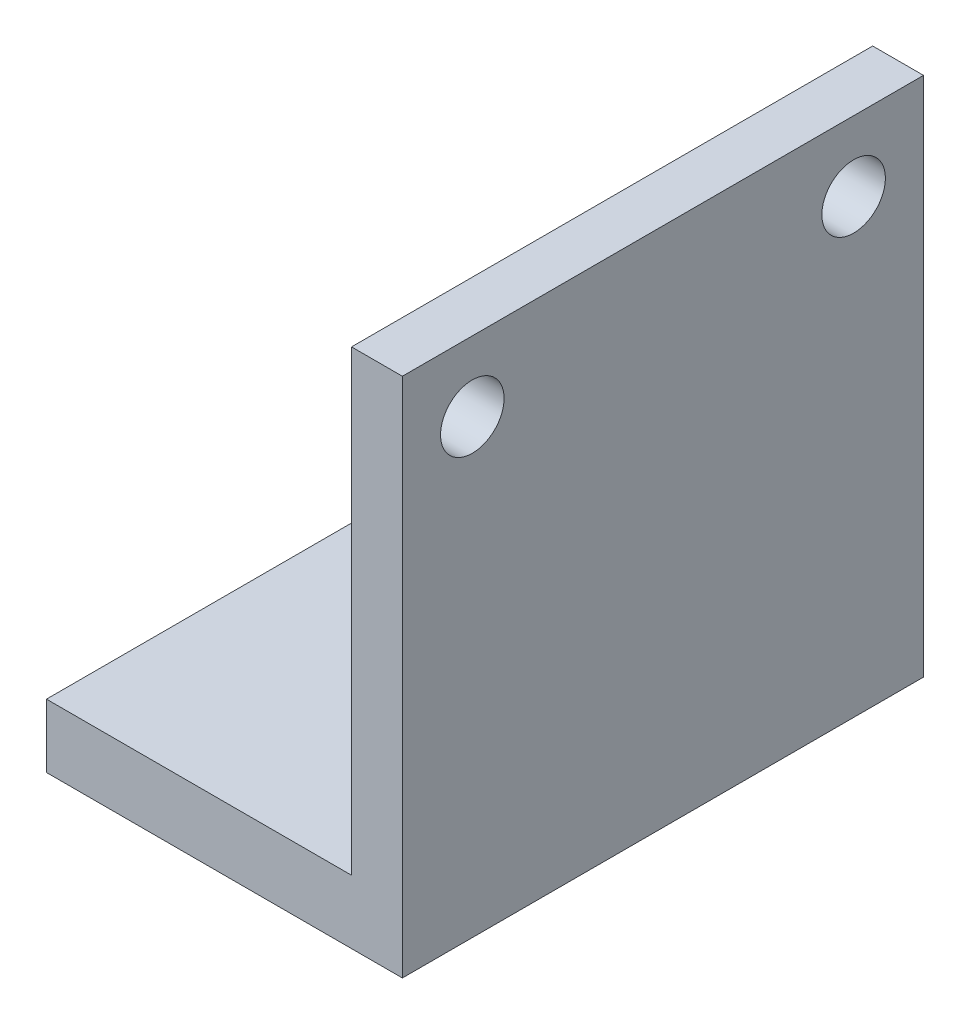
ISO-10303-21;
HEADER;
FILE_DESCRIPTION(('STEP AP214'),'2;1');
FILE_NAME('part.step','',(''),(''),'','','');
FILE_SCHEMA(('AUTOMOTIVE_DESIGN { 1 0 10303 214 1 1 1 1 }'));
ENDSEC;
DATA;
#1=APPLICATION_CONTEXT('core data for automotive mechanical design processes');
#2=APPLICATION_PROTOCOL_DEFINITION('international standard','automotive_design',2000,#1);
#3=PRODUCT_CONTEXT('',#1,'mechanical');
#4=PRODUCT('Part','Part','',(#3));
#5=PRODUCT_RELATED_PRODUCT_CATEGORY('part','',(#4));
#6=PRODUCT_DEFINITION_FORMATION('','',#4);
#7=PRODUCT_DEFINITION_CONTEXT('part definition',#1,'design');
#8=PRODUCT_DEFINITION('design','',#6,#7);
#9=PRODUCT_DEFINITION_SHAPE('','',#8);
#10=(LENGTH_UNIT() NAMED_UNIT(*) SI_UNIT(.MILLI.,.METRE.));
#11=(NAMED_UNIT(*) PLANE_ANGLE_UNIT() SI_UNIT($,.RADIAN.));
#12=(NAMED_UNIT(*) SI_UNIT($,.STERADIAN.) SOLID_ANGLE_UNIT());
#13=UNCERTAINTY_MEASURE_WITH_UNIT(LENGTH_MEASURE(1.E-05),#10,'distance_accuracy_value','');
#14=(GEOMETRIC_REPRESENTATION_CONTEXT(3) GLOBAL_UNCERTAINTY_ASSIGNED_CONTEXT((#13)) GLOBAL_UNIT_ASSIGNED_CONTEXT((#10,
#11,#12)) REPRESENTATION_CONTEXT('',''));
#15=CARTESIAN_POINT('',(0.,0.,0.));
#16=DIRECTION('',(0.,0.,1.));
#17=DIRECTION('',(1.,0.,0.));
#18=AXIS2_PLACEMENT_3D('',#15,#16,#17);
#19=CARTESIAN_POINT('',(0.,0.,0.));
#20=DIRECTION('',(-1.,0.,0.));
#21=DIRECTION('',(0.,0.,1.));
#22=AXIS2_PLACEMENT_3D('',#19,#20,#21);
#23=PLANE('',#22);
#24=CARTESIAN_POINT('',(0.,7.5,7.5));
#25=DIRECTION('',(1.,0.,0.));
#26=DIRECTION('',(0.,0.,-1.));
#27=AXIS2_PLACEMENT_3D('',#24,#25,#26);
#28=CIRCLE('',#27,1.25);
#29=CARTESIAN_POINT('',(0.,7.5,6.25));
#30=VERTEX_POINT('',#29);
#31=EDGE_CURVE('E124',#30,#30,#28,.T.);
#32=ORIENTED_EDGE('',*,*,#31,.T.);
#33=EDGE_LOOP('',(#32));
#34=FACE_BOUND('',#33,.T.);
#35=CARTESIAN_POINT('',(0.,7.49999999999999,-7.5));
#36=DIRECTION('',(1.,0.,0.));
#37=DIRECTION('',(0.,0.,-1.));
#38=AXIS2_PLACEMENT_3D('',#35,#36,#37);
#39=CIRCLE('',#38,1.25);
#40=CARTESIAN_POINT('',(0.,7.49999999999999,-8.75));
#41=VERTEX_POINT('',#40);
#42=EDGE_CURVE('E101',#41,#41,#39,.T.);
#43=ORIENTED_EDGE('',*,*,#42,.T.);
#44=EDGE_LOOP('',(#43));
#45=FACE_BOUND('',#44,.T.);
#46=DIRECTION('',(0.,1.,0.));
#47=VECTOR('',#46,1.);
#48=CARTESIAN_POINT('',(0.,-10.25,-10.25));
#49=LINE('',#48,#47);
#50=CARTESIAN_POINT('',(0.,-7.75,-10.25));
#51=VERTEX_POINT('',#50);
#52=CARTESIAN_POINT('',(0.,10.25,-10.25));
#53=VERTEX_POINT('',#52);
#54=EDGE_CURVE('E130',#51,#53,#49,.T.);
#55=ORIENTED_EDGE('',*,*,#54,.F.);
#56=DIRECTION('',(0.,0.,1.));
#57=VECTOR('',#56,1.);
#58=CARTESIAN_POINT('',(0.,-7.75,0.));
#59=LINE('',#58,#57);
#60=CARTESIAN_POINT('',(0.,-7.75,10.25));
#61=VERTEX_POINT('',#60);
#62=EDGE_CURVE('E98',#51,#61,#59,.T.);
#63=ORIENTED_EDGE('',*,*,#62,.T.);
#64=DIRECTION('',(0.,-1.,0.));
#65=VECTOR('',#64,1.);
#66=CARTESIAN_POINT('',(0.,-10.25,10.25));
#67=LINE('',#66,#65);
#68=CARTESIAN_POINT('',(0.,10.25,10.25));
#69=VERTEX_POINT('',#68);
#70=EDGE_CURVE('E135',#69,#61,#67,.T.);
#71=ORIENTED_EDGE('',*,*,#70,.F.);
#72=DIRECTION('',(0.,0.,1.));
#73=VECTOR('',#72,1.);
#74=CARTESIAN_POINT('',(0.,10.25,10.25));
#75=LINE('',#74,#73);
#76=EDGE_CURVE('E73',#53,#69,#75,.T.);
#77=ORIENTED_EDGE('',*,*,#76,.F.);
#78=EDGE_LOOP('',(#55,#63,#71,#77));
#79=FACE_BOUND('',#78,.T.);
#80=ADVANCED_FACE('F34',(#34,#45,#79),#23,.T.);
#81=CARTESIAN_POINT('',(2.,0.,0.));
#82=DIRECTION('',(-1.,0.,0.));
#83=DIRECTION('',(0.,0.,1.));
#84=AXIS2_PLACEMENT_3D('',#81,#82,#83);
#85=PLANE('',#84);
#86=DIRECTION('',(0.,1.,0.));
#87=VECTOR('',#86,1.);
#88=CARTESIAN_POINT('',(2.,-10.25,-10.25));
#89=LINE('',#88,#87);
#90=CARTESIAN_POINT('',(2.,-10.25,-10.25));
#91=VERTEX_POINT('',#90);
#92=CARTESIAN_POINT('',(2.,10.25,-10.25));
#93=VERTEX_POINT('',#92);
#94=EDGE_CURVE('E133',#91,#93,#89,.T.);
#95=ORIENTED_EDGE('',*,*,#94,.T.);
#96=DIRECTION('',(0.,0.,1.));
#97=VECTOR('',#96,1.);
#98=CARTESIAN_POINT('',(2.,10.25,10.25));
#99=LINE('',#98,#97);
#100=CARTESIAN_POINT('',(2.,10.25,10.25));
#101=VERTEX_POINT('',#100);
#102=EDGE_CURVE('E78',#93,#101,#99,.T.);
#103=ORIENTED_EDGE('',*,*,#102,.T.);
#104=DIRECTION('',(0.,-1.,0.));
#105=VECTOR('',#104,1.);
#106=CARTESIAN_POINT('',(2.,-10.25,10.25));
#107=LINE('',#106,#105);
#108=CARTESIAN_POINT('',(2.,-10.25,10.25));
#109=VERTEX_POINT('',#108);
#110=EDGE_CURVE('E137',#101,#109,#107,.T.);
#111=ORIENTED_EDGE('',*,*,#110,.T.);
#112=DIRECTION('',(0.,0.,-1.));
#113=VECTOR('',#112,1.);
#114=CARTESIAN_POINT('',(2.,-10.25,10.25));
#115=LINE('',#114,#113);
#116=EDGE_CURVE('E58',#109,#91,#115,.T.);
#117=ORIENTED_EDGE('',*,*,#116,.T.);
#118=EDGE_LOOP('',(#95,#103,#111,#117));
#119=FACE_BOUND('',#118,.T.);
#120=CARTESIAN_POINT('',(2.,7.5,7.5));
#121=DIRECTION('',(1.,0.,0.));
#122=DIRECTION('',(0.,0.,-1.));
#123=AXIS2_PLACEMENT_3D('',#120,#121,#122);
#124=CIRCLE('',#123,1.25);
#125=CARTESIAN_POINT('',(2.,7.5,6.25));
#126=VERTEX_POINT('',#125);
#127=EDGE_CURVE('E127',#126,#126,#124,.T.);
#128=ORIENTED_EDGE('',*,*,#127,.F.);
#129=EDGE_LOOP('',(#128));
#130=FACE_BOUND('',#129,.T.);
#131=CARTESIAN_POINT('',(2.,7.49999999999999,-7.5));
#132=DIRECTION('',(1.,0.,0.));
#133=DIRECTION('',(0.,0.,-1.));
#134=AXIS2_PLACEMENT_3D('',#131,#132,#133);
#135=CIRCLE('',#134,1.25);
#136=CARTESIAN_POINT('',(2.,7.49999999999999,-8.75));
#137=VERTEX_POINT('',#136);
#138=EDGE_CURVE('E121',#137,#137,#135,.T.);
#139=ORIENTED_EDGE('',*,*,#138,.F.);
#140=EDGE_LOOP('',(#139));
#141=FACE_BOUND('',#140,.T.);
#142=ADVANCED_FACE('F161',(#119,#130,#141),#85,.F.);
#143=CARTESIAN_POINT('',(2.,-10.25,-10.25));
#144=DIRECTION('',(0.,0.,1.));
#145=DIRECTION('',(1.,0.,0.));
#146=AXIS2_PLACEMENT_3D('',#143,#144,#145);
#147=PLANE('',#146);
#148=DIRECTION('',(-1.,0.,0.));
#149=VECTOR('',#148,1.);
#150=CARTESIAN_POINT('',(2.,-10.25,-10.25));
#151=LINE('',#150,#149);
#152=CARTESIAN_POINT('',(-12.,-10.25,-10.25));
#153=VERTEX_POINT('',#152);
#154=EDGE_CURVE('E106',#91,#153,#151,.T.);
#155=ORIENTED_EDGE('',*,*,#154,.T.);
#156=DIRECTION('',(0.,-1.,0.));
#157=VECTOR('',#156,1.);
#158=CARTESIAN_POINT('',(-12.,0.,-10.25));
#159=LINE('',#158,#157);
#160=CARTESIAN_POINT('',(-12.,-7.75,-10.25));
#161=VERTEX_POINT('',#160);
#162=EDGE_CURVE('E104',#161,#153,#159,.T.);
#163=ORIENTED_EDGE('',*,*,#162,.F.);
#164=DIRECTION('',(1.,0.,0.));
#165=VECTOR('',#164,1.);
#166=CARTESIAN_POINT('',(-12.,-7.75,-10.25));
#167=LINE('',#166,#165);
#168=EDGE_CURVE('E93',#161,#51,#167,.T.);
#169=ORIENTED_EDGE('',*,*,#168,.T.);
#170=ORIENTED_EDGE('',*,*,#54,.T.);
#171=DIRECTION('',(-1.,0.,0.));
#172=VECTOR('',#171,1.);
#173=CARTESIAN_POINT('',(2.,10.25,-10.25));
#174=LINE('',#173,#172);
#175=EDGE_CURVE('E11',#93,#53,#174,.T.);
#176=ORIENTED_EDGE('',*,*,#175,.F.);
#177=ORIENTED_EDGE('',*,*,#94,.F.);
#178=EDGE_LOOP('',(#155,#163,#169,#170,#176,#177));
#179=FACE_BOUND('',#178,.T.);
#180=ADVANCED_FACE('F36',(#179),#147,.F.);
#181=CARTESIAN_POINT('',(2.,10.25,10.25));
#182=DIRECTION('',(0.,-1.,0.));
#183=DIRECTION('',(0.,0.,-1.));
#184=AXIS2_PLACEMENT_3D('',#181,#182,#183);
#185=PLANE('',#184);
#186=ORIENTED_EDGE('',*,*,#76,.T.);
#187=DIRECTION('',(-1.,0.,0.));
#188=VECTOR('',#187,1.);
#189=CARTESIAN_POINT('',(2.,10.25,10.25));
#190=LINE('',#189,#188);
#191=EDGE_CURVE('E42',#101,#69,#190,.T.);
#192=ORIENTED_EDGE('',*,*,#191,.F.);
#193=ORIENTED_EDGE('',*,*,#102,.F.);
#194=ORIENTED_EDGE('',*,*,#175,.T.);
#195=EDGE_LOOP('',(#186,#192,#193,#194));
#196=FACE_BOUND('',#195,.T.);
#197=ADVANCED_FACE('F153',(#196),#185,.F.);
#198=CARTESIAN_POINT('',(2.,-10.25,10.25));
#199=DIRECTION('',(0.,0.,-1.));
#200=DIRECTION('',(-1.,0.,0.));
#201=AXIS2_PLACEMENT_3D('',#198,#199,#200);
#202=PLANE('',#201);
#203=ORIENTED_EDGE('',*,*,#70,.T.);
#204=DIRECTION('',(1.,0.,0.));
#205=VECTOR('',#204,1.);
#206=CARTESIAN_POINT('',(-12.,-7.75,10.25));
#207=LINE('',#206,#205);
#208=CARTESIAN_POINT('',(-12.,-7.75,10.25));
#209=VERTEX_POINT('',#208);
#210=EDGE_CURVE('E49',#209,#61,#207,.T.);
#211=ORIENTED_EDGE('',*,*,#210,.F.);
#212=DIRECTION('',(0.,1.,0.));
#213=VECTOR('',#212,1.);
#214=CARTESIAN_POINT('',(-12.,0.,10.25));
#215=LINE('',#214,#213);
#216=CARTESIAN_POINT('',(-12.,-10.25,10.25));
#217=VERTEX_POINT('',#216);
#218=EDGE_CURVE('E114',#217,#209,#215,.T.);
#219=ORIENTED_EDGE('',*,*,#218,.F.);
#220=DIRECTION('',(-1.,0.,0.));
#221=VECTOR('',#220,1.);
#222=CARTESIAN_POINT('',(2.,-10.25,10.25));
#223=LINE('',#222,#221);
#224=EDGE_CURVE('E145',#109,#217,#223,.T.);
#225=ORIENTED_EDGE('',*,*,#224,.F.);
#226=ORIENTED_EDGE('',*,*,#110,.F.);
#227=ORIENTED_EDGE('',*,*,#191,.T.);
#228=EDGE_LOOP('',(#203,#211,#219,#225,#226,#227));
#229=FACE_BOUND('',#228,.T.);
#230=ADVANCED_FACE('F149',(#229),#202,.F.);
#231=CARTESIAN_POINT('',(2.,-10.25,10.25));
#232=DIRECTION('',(0.,1.,0.));
#233=DIRECTION('',(0.,0.,1.));
#234=AXIS2_PLACEMENT_3D('',#231,#232,#233);
#235=PLANE('',#234);
#236=ORIENTED_EDGE('',*,*,#224,.T.);
#237=DIRECTION('',(0.,0.,1.));
#238=VECTOR('',#237,1.);
#239=CARTESIAN_POINT('',(-12.,-10.25,0.));
#240=LINE('',#239,#238);
#241=EDGE_CURVE('E110',#153,#217,#240,.T.);
#242=ORIENTED_EDGE('',*,*,#241,.F.);
#243=ORIENTED_EDGE('',*,*,#154,.F.);
#244=ORIENTED_EDGE('',*,*,#116,.F.);
#245=EDGE_LOOP('',(#236,#242,#243,#244));
#246=FACE_BOUND('',#245,.T.);
#247=ADVANCED_FACE('F159',(#246),#235,.F.);
#248=CARTESIAN_POINT('',(2.,7.5,7.5));
#249=DIRECTION('',(-1.,0.,0.));
#250=DIRECTION('',(0.,0.,1.));
#251=AXIS2_PLACEMENT_3D('',#248,#249,#250);
#252=CYLINDRICAL_SURFACE('',#251,1.25);
#253=ORIENTED_EDGE('',*,*,#127,.T.);
#254=EDGE_LOOP('',(#253));
#255=FACE_BOUND('',#254,.T.);
#256=ORIENTED_EDGE('',*,*,#31,.F.);
#257=EDGE_LOOP('',(#256));
#258=FACE_BOUND('',#257,.T.);
#259=ADVANCED_FACE('F173',(#255,#258),#252,.F.);
#260=CARTESIAN_POINT('',(2.,7.49999999999999,-7.5));
#261=DIRECTION('',(-1.,0.,0.));
#262=DIRECTION('',(0.,0.,1.));
#263=AXIS2_PLACEMENT_3D('',#260,#261,#262);
#264=CYLINDRICAL_SURFACE('',#263,1.25);
#265=ORIENTED_EDGE('',*,*,#138,.T.);
#266=EDGE_LOOP('',(#265));
#267=FACE_BOUND('',#266,.T.);
#268=ORIENTED_EDGE('',*,*,#42,.F.);
#269=EDGE_LOOP('',(#268));
#270=FACE_BOUND('',#269,.T.);
#271=ADVANCED_FACE('F178',(#267,#270),#264,.F.);
#272=CARTESIAN_POINT('',(-12.,-7.75,0.));
#273=DIRECTION('',(0.,1.,0.));
#274=DIRECTION('',(0.,0.,1.));
#275=AXIS2_PLACEMENT_3D('',#272,#273,#274);
#276=PLANE('',#275);
#277=ORIENTED_EDGE('',*,*,#62,.F.);
#278=ORIENTED_EDGE('',*,*,#168,.F.);
#279=DIRECTION('',(0.,0.,1.));
#280=VECTOR('',#279,1.);
#281=CARTESIAN_POINT('',(-12.,-7.75,0.));
#282=LINE('',#281,#280);
#283=EDGE_CURVE('E97',#161,#209,#282,.T.);
#284=ORIENTED_EDGE('',*,*,#283,.T.);
#285=ORIENTED_EDGE('',*,*,#210,.T.);
#286=EDGE_LOOP('',(#277,#278,#284,#285));
#287=FACE_BOUND('',#286,.T.);
#288=ADVANCED_FACE('F95',(#287),#276,.T.);
#289=CARTESIAN_POINT('',(-12.,0.,0.));
#290=DIRECTION('',(-1.,0.,0.));
#291=DIRECTION('',(0.,0.,1.));
#292=AXIS2_PLACEMENT_3D('',#289,#290,#291);
#293=PLANE('',#292);
#294=ORIENTED_EDGE('',*,*,#283,.F.);
#295=ORIENTED_EDGE('',*,*,#162,.T.);
#296=ORIENTED_EDGE('',*,*,#241,.T.);
#297=ORIENTED_EDGE('',*,*,#218,.T.);
#298=EDGE_LOOP('',(#294,#295,#296,#297));
#299=FACE_BOUND('',#298,.T.);
#300=ADVANCED_FACE('F112',(#299),#293,.T.);
#301=CLOSED_SHELL('',(#80,#142,#180,#197,#230,#247,#259,#271,#288,#300));
#302=MANIFOLD_SOLID_BREP('B2',#301);
#303=ADVANCED_BREP_SHAPE_REPRESENTATION('',(#18,#302),#14);
#304=SHAPE_DEFINITION_REPRESENTATION(#9,#303);
ENDSEC;
END-ISO-10303-21;
